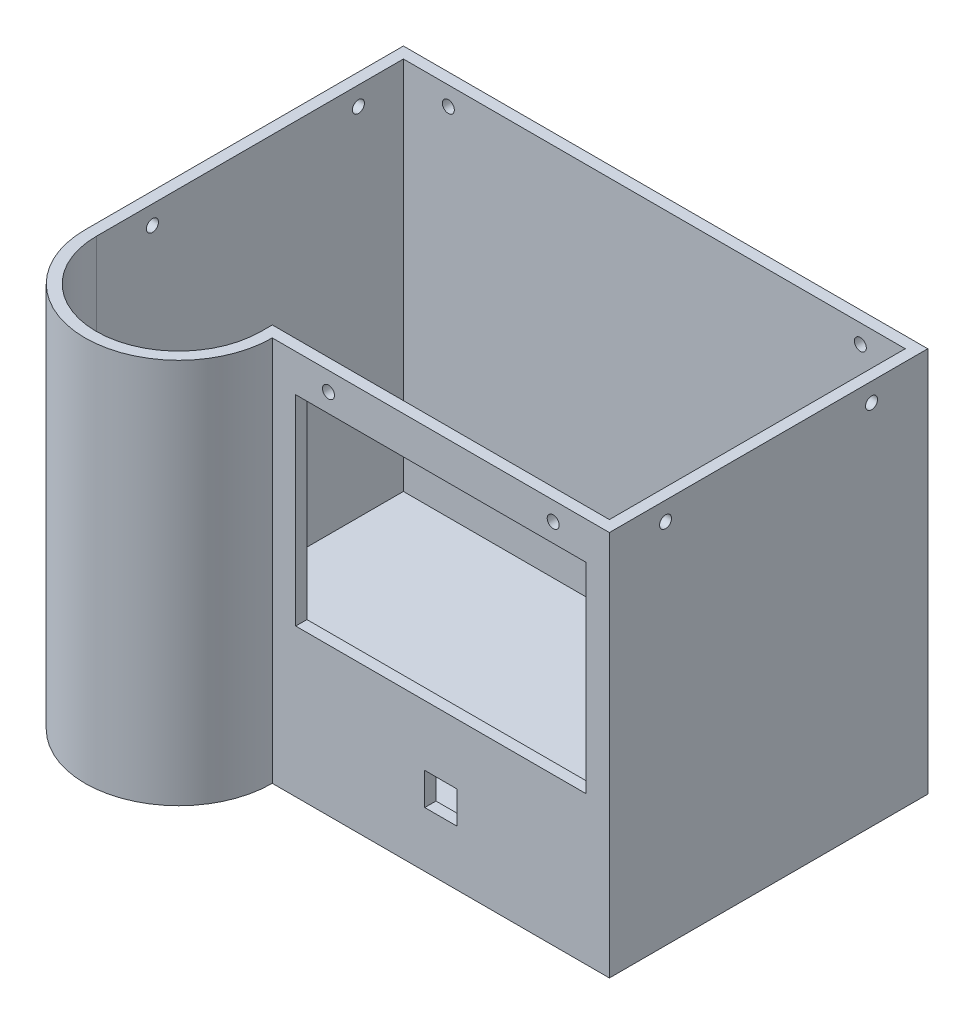
ISO-10303-21;
HEADER;
FILE_DESCRIPTION(('STEP AP214'),'2;1');
FILE_NAME('part.step','',(''),(''),'','','');
FILE_SCHEMA(('AUTOMOTIVE_DESIGN { 1 0 10303 214 1 1 1 1 }'));
ENDSEC;
DATA;
#1=APPLICATION_CONTEXT('core data for automotive mechanical design processes');
#2=APPLICATION_PROTOCOL_DEFINITION('international standard','automotive_design',2000,#1);
#3=PRODUCT_CONTEXT('',#1,'mechanical');
#4=PRODUCT('Part','Part','',(#3));
#5=PRODUCT_RELATED_PRODUCT_CATEGORY('part','',(#4));
#6=PRODUCT_DEFINITION_FORMATION('','',#4);
#7=PRODUCT_DEFINITION_CONTEXT('part definition',#1,'design');
#8=PRODUCT_DEFINITION('design','',#6,#7);
#9=PRODUCT_DEFINITION_SHAPE('','',#8);
#10=(LENGTH_UNIT() NAMED_UNIT(*) SI_UNIT(.MILLI.,.METRE.));
#11=(NAMED_UNIT(*) PLANE_ANGLE_UNIT() SI_UNIT($,.RADIAN.));
#12=(NAMED_UNIT(*) SI_UNIT($,.STERADIAN.) SOLID_ANGLE_UNIT());
#13=UNCERTAINTY_MEASURE_WITH_UNIT(LENGTH_MEASURE(1.E-05),#10,'distance_accuracy_value','');
#14=(GEOMETRIC_REPRESENTATION_CONTEXT(3) GLOBAL_UNCERTAINTY_ASSIGNED_CONTEXT((#13)) GLOBAL_UNIT_ASSIGNED_CONTEXT((#10,
#11,#12)) REPRESENTATION_CONTEXT('',''));
#15=CARTESIAN_POINT('',(0.,0.,0.));
#16=DIRECTION('',(0.,0.,1.));
#17=DIRECTION('',(1.,0.,0.));
#18=AXIS2_PLACEMENT_3D('',#15,#16,#17);
#19=CARTESIAN_POINT('',(25.,3.,0.));
#20=DIRECTION('',(0.,1.,0.));
#21=DIRECTION('',(0.,0.,1.));
#22=AXIS2_PLACEMENT_3D('',#19,#20,#21);
#23=PLANE('',#22);
#24=CARTESIAN_POINT('',(25.,3.,0.));
#25=DIRECTION('',(0.,1.,0.));
#26=DIRECTION('',(0.,0.,1.));
#27=AXIS2_PLACEMENT_3D('',#24,#25,#26);
#28=CIRCLE('',#27,22.);
#29=CARTESIAN_POINT('',(3.00000000000001,3.,0.));
#30=VERTEX_POINT('',#29);
#31=CARTESIAN_POINT('',(47.,3.,0.));
#32=VERTEX_POINT('',#31);
#33=EDGE_CURVE('E227',#30,#32,#28,.T.);
#34=ORIENTED_EDGE('',*,*,#33,.T.);
#35=DIRECTION('',(0.,0.,-1.));
#36=VECTOR('',#35,1.);
#37=CARTESIAN_POINT('',(47.,3.,0.));
#38=LINE('',#37,#36);
#39=CARTESIAN_POINT('',(47.,3.,-3.));
#40=VERTEX_POINT('',#39);
#41=EDGE_CURVE('E242',#32,#40,#38,.T.);
#42=ORIENTED_EDGE('',*,*,#41,.T.);
#43=DIRECTION('',(1.,0.,0.));
#44=VECTOR('',#43,1.);
#45=CARTESIAN_POINT('',(0.,3.,-3.));
#46=LINE('',#45,#44);
#47=CARTESIAN_POINT('',(137.,3.,-3.));
#48=VERTEX_POINT('',#47);
#49=EDGE_CURVE('E294',#40,#48,#46,.T.);
#50=ORIENTED_EDGE('',*,*,#49,.T.);
#51=DIRECTION('',(0.,0.,1.));
#52=VECTOR('',#51,1.);
#53=CARTESIAN_POINT('',(137.,3.,0.));
#54=LINE('',#53,#52);
#55=CARTESIAN_POINT('',(137.,3.,-82.));
#56=VERTEX_POINT('',#55);
#57=EDGE_CURVE('E290',#56,#48,#54,.T.);
#58=ORIENTED_EDGE('',*,*,#57,.F.);
#59=DIRECTION('',(1.,0.,0.));
#60=VECTOR('',#59,1.);
#61=CARTESIAN_POINT('',(0.,3.,-82.));
#62=LINE('',#61,#60);
#63=CARTESIAN_POINT('',(3.,3.,-82.));
#64=VERTEX_POINT('',#63);
#65=EDGE_CURVE('E286',#64,#56,#62,.T.);
#66=ORIENTED_EDGE('',*,*,#65,.F.);
#67=DIRECTION('',(0.,0.,1.));
#68=VECTOR('',#67,1.);
#69=CARTESIAN_POINT('',(3.00000000000001,3.,0.));
#70=LINE('',#69,#68);
#71=EDGE_CURVE('E283',#64,#30,#70,.T.);
#72=ORIENTED_EDGE('',*,*,#71,.T.);
#73=EDGE_LOOP('',(#34,#42,#50,#58,#66,#72));
#74=FACE_BOUND('',#73,.T.);
#75=CARTESIAN_POINT('',(25.,3.,0.));
#76=DIRECTION('',(0.,1.,0.));
#77=DIRECTION('',(0.,0.,1.));
#78=AXIS2_PLACEMENT_3D('',#75,#76,#77);
#79=CIRCLE('',#78,13.8);
#80=CARTESIAN_POINT('',(25.,3.,13.8));
#81=VERTEX_POINT('',#80);
#82=EDGE_CURVE('E323',#81,#81,#79,.T.);
#83=ORIENTED_EDGE('',*,*,#82,.F.);
#84=EDGE_LOOP('',(#83));
#85=FACE_BOUND('',#84,.T.);
#86=ADVANCED_FACE('F40',(#74,#85),#23,.T.);
#87=CARTESIAN_POINT('',(25.,0.,0.));
#88=DIRECTION('',(0.,1.,0.));
#89=DIRECTION('',(0.,0.,1.));
#90=AXIS2_PLACEMENT_3D('',#87,#88,#89);
#91=PLANE('',#90);
#92=CARTESIAN_POINT('',(25.,0.,0.));
#93=DIRECTION('',(0.,1.,0.));
#94=DIRECTION('',(0.,0.,1.));
#95=AXIS2_PLACEMENT_3D('',#92,#93,#94);
#96=CIRCLE('',#95,25.);
#97=CARTESIAN_POINT('',(0.,0.,0.));
#98=VERTEX_POINT('',#97);
#99=CARTESIAN_POINT('',(50.,0.,0.));
#100=VERTEX_POINT('',#99);
#101=EDGE_CURVE('E327',#98,#100,#96,.T.);
#102=ORIENTED_EDGE('',*,*,#101,.F.);
#103=DIRECTION('',(0.,0.,1.));
#104=VECTOR('',#103,1.);
#105=CARTESIAN_POINT('',(0.,0.,0.));
#106=LINE('',#105,#104);
#107=CARTESIAN_POINT('',(0.,0.,-85.));
#108=VERTEX_POINT('',#107);
#109=EDGE_CURVE('E343',#108,#98,#106,.T.);
#110=ORIENTED_EDGE('',*,*,#109,.F.);
#111=DIRECTION('',(-1.,0.,0.));
#112=VECTOR('',#111,1.);
#113=CARTESIAN_POINT('',(0.,0.,-85.));
#114=LINE('',#113,#112);
#115=CARTESIAN_POINT('',(140.,0.,-85.));
#116=VERTEX_POINT('',#115);
#117=EDGE_CURVE('E340',#116,#108,#114,.T.);
#118=ORIENTED_EDGE('',*,*,#117,.F.);
#119=DIRECTION('',(0.,0.,-1.));
#120=VECTOR('',#119,1.);
#121=CARTESIAN_POINT('',(140.,0.,0.));
#122=LINE('',#121,#120);
#123=CARTESIAN_POINT('',(140.,0.,0.));
#124=VERTEX_POINT('',#123);
#125=EDGE_CURVE('E337',#124,#116,#122,.T.);
#126=ORIENTED_EDGE('',*,*,#125,.F.);
#127=DIRECTION('',(1.,0.,0.));
#128=VECTOR('',#127,1.);
#129=CARTESIAN_POINT('',(50.,0.,0.));
#130=LINE('',#129,#128);
#131=EDGE_CURVE('E334',#100,#124,#130,.T.);
#132=ORIENTED_EDGE('',*,*,#131,.F.);
#133=EDGE_LOOP('',(#102,#110,#118,#126,#132));
#134=FACE_BOUND('',#133,.T.);
#135=CARTESIAN_POINT('',(25.,0.,0.));
#136=DIRECTION('',(0.,1.,0.));
#137=DIRECTION('',(0.,0.,1.));
#138=AXIS2_PLACEMENT_3D('',#135,#136,#137);
#139=CIRCLE('',#138,13.8);
#140=CARTESIAN_POINT('',(25.,0.,13.8));
#141=VERTEX_POINT('',#140);
#142=EDGE_CURVE('E322',#141,#141,#139,.T.);
#143=ORIENTED_EDGE('',*,*,#142,.T.);
#144=EDGE_LOOP('',(#143));
#145=FACE_BOUND('',#144,.T.);
#146=ADVANCED_FACE('F467',(#134,#145),#91,.F.);
#147=CARTESIAN_POINT('',(25.,3.,0.));
#148=DIRECTION('',(0.,-1.,0.));
#149=DIRECTION('',(0.,0.,-1.));
#150=AXIS2_PLACEMENT_3D('',#147,#148,#149);
#151=CYLINDRICAL_SURFACE('',#150,25.);
#152=ORIENTED_EDGE('',*,*,#101,.T.);
#153=DIRECTION('',(0.,-1.,0.));
#154=VECTOR('',#153,1.);
#155=CARTESIAN_POINT('',(50.,3.,0.));
#156=LINE('',#155,#154);
#157=CARTESIAN_POINT('',(50.,103.,0.));
#158=VERTEX_POINT('',#157);
#159=EDGE_CURVE('E362',#158,#100,#156,.T.);
#160=ORIENTED_EDGE('',*,*,#159,.F.);
#161=CARTESIAN_POINT('',(25.,103.,0.));
#162=DIRECTION('',(0.,1.,0.));
#163=DIRECTION('',(0.,0.,1.));
#164=AXIS2_PLACEMENT_3D('',#161,#162,#163);
#165=CIRCLE('',#164,25.);
#166=CARTESIAN_POINT('',(0.,103.,0.));
#167=VERTEX_POINT('',#166);
#168=EDGE_CURVE('E264',#167,#158,#165,.T.);
#169=ORIENTED_EDGE('',*,*,#168,.F.);
#170=DIRECTION('',(0.,-1.,0.));
#171=VECTOR('',#170,1.);
#172=CARTESIAN_POINT('',(0.,3.,0.));
#173=LINE('',#172,#171);
#174=EDGE_CURVE('E346',#167,#98,#173,.T.);
#175=ORIENTED_EDGE('',*,*,#174,.T.);
#176=EDGE_LOOP('',(#152,#160,#169,#175));
#177=FACE_BOUND('',#176,.T.);
#178=ADVANCED_FACE('F42',(#177),#151,.T.);
#179=CARTESIAN_POINT('',(50.,3.,0.));
#180=DIRECTION('',(0.,0.,-1.));
#181=DIRECTION('',(-1.,0.,0.));
#182=AXIS2_PLACEMENT_3D('',#179,#180,#181);
#183=PLANE('',#182);
#184=CARTESIAN_POINT('',(65.,98.,0.));
#185=DIRECTION('',(0.,0.,1.));
#186=DIRECTION('',(1.,0.,0.));
#187=AXIS2_PLACEMENT_3D('',#184,#185,#186);
#188=CIRCLE('',#187,1.60000000000001);
#189=CARTESIAN_POINT('',(66.6,98.,0.));
#190=VERTEX_POINT('',#189);
#191=EDGE_CURVE('E391',#190,#190,#188,.T.);
#192=ORIENTED_EDGE('',*,*,#191,.F.);
#193=EDGE_LOOP('',(#192));
#194=FACE_BOUND('',#193,.T.);
#195=CARTESIAN_POINT('',(125.,98.,0.));
#196=DIRECTION('',(0.,0.,1.));
#197=DIRECTION('',(1.,0.,0.));
#198=AXIS2_PLACEMENT_3D('',#195,#196,#197);
#199=CIRCLE('',#198,1.60000000000002);
#200=CARTESIAN_POINT('',(126.6,98.,0.));
#201=VERTEX_POINT('',#200);
#202=EDGE_CURVE('E404',#201,#201,#199,.T.);
#203=ORIENTED_EDGE('',*,*,#202,.F.);
#204=EDGE_LOOP('',(#203));
#205=FACE_BOUND('',#204,.T.);
#206=DIRECTION('',(1.,0.,0.));
#207=VECTOR('',#206,1.);
#208=CARTESIAN_POINT('',(90.7,14.762,0.));
#209=LINE('',#208,#207);
#210=CARTESIAN_POINT('',(90.7,14.762,0.));
#211=VERTEX_POINT('',#210);
#212=CARTESIAN_POINT('',(99.3,14.762,0.));
#213=VERTEX_POINT('',#212);
#214=EDGE_CURVE('E186',#211,#213,#209,.T.);
#215=ORIENTED_EDGE('',*,*,#214,.F.);
#216=DIRECTION('',(0.,-1.,0.));
#217=VECTOR('',#216,1.);
#218=CARTESIAN_POINT('',(90.7,23.362,0.));
#219=LINE('',#218,#217);
#220=CARTESIAN_POINT('',(90.7,23.362,0.));
#221=VERTEX_POINT('',#220);
#222=EDGE_CURVE('E58',#221,#211,#219,.T.);
#223=ORIENTED_EDGE('',*,*,#222,.F.);
#224=DIRECTION('',(-1.,0.,0.));
#225=VECTOR('',#224,1.);
#226=CARTESIAN_POINT('',(90.7,23.362,0.));
#227=LINE('',#226,#225);
#228=CARTESIAN_POINT('',(99.3,23.362,0.));
#229=VERTEX_POINT('',#228);
#230=EDGE_CURVE('E194',#229,#221,#227,.T.);
#231=ORIENTED_EDGE('',*,*,#230,.F.);
#232=DIRECTION('',(0.,1.,0.));
#233=VECTOR('',#232,1.);
#234=CARTESIAN_POINT('',(99.3,23.362,0.));
#235=LINE('',#234,#233);
#236=EDGE_CURVE('E176',#213,#229,#235,.T.);
#237=ORIENTED_EDGE('',*,*,#236,.F.);
#238=EDGE_LOOP('',(#215,#223,#231,#237));
#239=FACE_BOUND('',#238,.T.);
#240=DIRECTION('',(1.,0.,0.));
#241=VECTOR('',#240,1.);
#242=CARTESIAN_POINT('',(56.25,39.5,0.));
#243=LINE('',#242,#241);
#244=CARTESIAN_POINT('',(56.25,39.5,0.));
#245=VERTEX_POINT('',#244);
#246=CARTESIAN_POINT('',(133.75,39.5,0.));
#247=VERTEX_POINT('',#246);
#248=EDGE_CURVE('E211',#245,#247,#243,.T.);
#249=ORIENTED_EDGE('',*,*,#248,.F.);
#250=DIRECTION('',(0.,-1.,0.));
#251=VECTOR('',#250,1.);
#252=CARTESIAN_POINT('',(56.25,93.,0.));
#253=LINE('',#252,#251);
#254=CARTESIAN_POINT('',(56.25,93.,0.));
#255=VERTEX_POINT('',#254);
#256=EDGE_CURVE('E204',#255,#245,#253,.T.);
#257=ORIENTED_EDGE('',*,*,#256,.F.);
#258=DIRECTION('',(-1.,0.,0.));
#259=VECTOR('',#258,1.);
#260=CARTESIAN_POINT('',(56.25,93.,0.));
#261=LINE('',#260,#259);
#262=CARTESIAN_POINT('',(133.75,93.,0.));
#263=VERTEX_POINT('',#262);
#264=EDGE_CURVE('E219',#263,#255,#261,.T.);
#265=ORIENTED_EDGE('',*,*,#264,.F.);
#266=DIRECTION('',(0.,1.,0.));
#267=VECTOR('',#266,1.);
#268=CARTESIAN_POINT('',(133.75,93.,0.));
#269=LINE('',#268,#267);
#270=EDGE_CURVE('E215',#247,#263,#269,.T.);
#271=ORIENTED_EDGE('',*,*,#270,.F.);
#272=EDGE_LOOP('',(#249,#257,#265,#271));
#273=FACE_BOUND('',#272,.T.);
#274=ORIENTED_EDGE('',*,*,#131,.T.);
#275=DIRECTION('',(0.,-1.,0.));
#276=VECTOR('',#275,1.);
#277=CARTESIAN_POINT('',(140.,3.,0.));
#278=LINE('',#277,#276);
#279=CARTESIAN_POINT('',(140.,103.,0.));
#280=VERTEX_POINT('',#279);
#281=EDGE_CURVE('E358',#280,#124,#278,.T.);
#282=ORIENTED_EDGE('',*,*,#281,.F.);
#283=DIRECTION('',(1.,0.,0.));
#284=VECTOR('',#283,1.);
#285=CARTESIAN_POINT('',(0.,103.,0.));
#286=LINE('',#285,#284);
#287=EDGE_CURVE('E268',#158,#280,#286,.T.);
#288=ORIENTED_EDGE('',*,*,#287,.F.);
#289=ORIENTED_EDGE('',*,*,#159,.T.);
#290=EDGE_LOOP('',(#274,#282,#288,#289));
#291=FACE_BOUND('',#290,.T.);
#292=ADVANCED_FACE('F191',(#194,#205,#239,#273,#291),#183,.F.);
#293=CARTESIAN_POINT('',(140.,3.,0.));
#294=DIRECTION('',(-1.,0.,0.));
#295=DIRECTION('',(0.,0.,1.));
#296=AXIS2_PLACEMENT_3D('',#293,#294,#295);
#297=PLANE('',#296);
#298=CARTESIAN_POINT('',(140.,98.,-15.));
#299=DIRECTION('',(1.,0.,0.));
#300=DIRECTION('',(0.,0.,-1.));
#301=AXIS2_PLACEMENT_3D('',#298,#299,#300);
#302=CIRCLE('',#301,1.60000000000001);
#303=CARTESIAN_POINT('',(140.,98.,-16.6));
#304=VERTEX_POINT('',#303);
#305=EDGE_CURVE('E400',#304,#304,#302,.T.);
#306=ORIENTED_EDGE('',*,*,#305,.F.);
#307=EDGE_LOOP('',(#306));
#308=FACE_BOUND('',#307,.T.);
#309=CARTESIAN_POINT('',(140.,98.,-70.));
#310=DIRECTION('',(1.,0.,0.));
#311=DIRECTION('',(0.,0.,-1.));
#312=AXIS2_PLACEMENT_3D('',#309,#310,#311);
#313=CIRCLE('',#312,1.59999999999999);
#314=CARTESIAN_POINT('',(140.,98.,-71.6));
#315=VERTEX_POINT('',#314);
#316=EDGE_CURVE('E413',#315,#315,#313,.T.);
#317=ORIENTED_EDGE('',*,*,#316,.F.);
#318=EDGE_LOOP('',(#317));
#319=FACE_BOUND('',#318,.T.);
#320=ORIENTED_EDGE('',*,*,#125,.T.);
#321=DIRECTION('',(0.,-1.,0.));
#322=VECTOR('',#321,1.);
#323=CARTESIAN_POINT('',(140.,3.,-85.));
#324=LINE('',#323,#322);
#325=CARTESIAN_POINT('',(140.,103.,-85.));
#326=VERTEX_POINT('',#325);
#327=EDGE_CURVE('E354',#326,#116,#324,.T.);
#328=ORIENTED_EDGE('',*,*,#327,.F.);
#329=DIRECTION('',(0.,0.,-1.));
#330=VECTOR('',#329,1.);
#331=CARTESIAN_POINT('',(140.,103.,0.));
#332=LINE('',#331,#330);
#333=EDGE_CURVE('E272',#280,#326,#332,.T.);
#334=ORIENTED_EDGE('',*,*,#333,.F.);
#335=ORIENTED_EDGE('',*,*,#281,.T.);
#336=EDGE_LOOP('',(#320,#328,#334,#335));
#337=FACE_BOUND('',#336,.T.);
#338=ADVANCED_FACE('F456',(#308,#319,#337),#297,.F.);
#339=CARTESIAN_POINT('',(0.,3.,-85.));
#340=DIRECTION('',(0.,0.,1.));
#341=DIRECTION('',(1.,0.,0.));
#342=AXIS2_PLACEMENT_3D('',#339,#340,#341);
#343=PLANE('',#342);
#344=CARTESIAN_POINT('',(125.,98.,-85.));
#345=DIRECTION('',(0.,0.,-1.));
#346=DIRECTION('',(-1.,0.,0.));
#347=AXIS2_PLACEMENT_3D('',#344,#345,#346);
#348=CIRCLE('',#347,1.60000000000001);
#349=CARTESIAN_POINT('',(123.4,98.,-85.));
#350=VERTEX_POINT('',#349);
#351=EDGE_CURVE('E410',#350,#350,#348,.T.);
#352=ORIENTED_EDGE('',*,*,#351,.F.);
#353=EDGE_LOOP('',(#352));
#354=FACE_BOUND('',#353,.T.);
#355=CARTESIAN_POINT('',(15.,98.,-85.));
#356=DIRECTION('',(0.,0.,-1.));
#357=DIRECTION('',(-1.,0.,0.));
#358=AXIS2_PLACEMENT_3D('',#355,#356,#357);
#359=CIRCLE('',#358,1.60000000000001);
#360=CARTESIAN_POINT('',(13.4,98.,-85.));
#361=VERTEX_POINT('',#360);
#362=EDGE_CURVE('E423',#361,#361,#359,.T.);
#363=ORIENTED_EDGE('',*,*,#362,.F.);
#364=EDGE_LOOP('',(#363));
#365=FACE_BOUND('',#364,.T.);
#366=ORIENTED_EDGE('',*,*,#117,.T.);
#367=DIRECTION('',(0.,-1.,0.));
#368=VECTOR('',#367,1.);
#369=CARTESIAN_POINT('',(0.,3.,-85.));
#370=LINE('',#369,#368);
#371=CARTESIAN_POINT('',(0.,103.,-85.));
#372=VERTEX_POINT('',#371);
#373=EDGE_CURVE('E350',#372,#108,#370,.T.);
#374=ORIENTED_EDGE('',*,*,#373,.F.);
#375=DIRECTION('',(-1.,0.,0.));
#376=VECTOR('',#375,1.);
#377=CARTESIAN_POINT('',(0.,103.,-85.));
#378=LINE('',#377,#376);
#379=EDGE_CURVE('E276',#326,#372,#378,.T.);
#380=ORIENTED_EDGE('',*,*,#379,.F.);
#381=ORIENTED_EDGE('',*,*,#327,.T.);
#382=EDGE_LOOP('',(#366,#374,#380,#381));
#383=FACE_BOUND('',#382,.T.);
#384=ADVANCED_FACE('F463',(#354,#365,#383),#343,.F.);
#385=CARTESIAN_POINT('',(0.,3.,0.));
#386=DIRECTION('',(1.,0.,0.));
#387=DIRECTION('',(0.,0.,-1.));
#388=AXIS2_PLACEMENT_3D('',#385,#386,#387);
#389=PLANE('',#388);
#390=CARTESIAN_POINT('',(0.,98.,-70.));
#391=DIRECTION('',(-1.,0.,0.));
#392=DIRECTION('',(0.,0.,1.));
#393=AXIS2_PLACEMENT_3D('',#390,#391,#392);
#394=CIRCLE('',#393,1.60000000000001);
#395=CARTESIAN_POINT('',(0.,98.,-68.4));
#396=VERTEX_POINT('',#395);
#397=EDGE_CURVE('E417',#396,#396,#394,.T.);
#398=ORIENTED_EDGE('',*,*,#397,.F.);
#399=EDGE_LOOP('',(#398));
#400=FACE_BOUND('',#399,.T.);
#401=CARTESIAN_POINT('',(0.,98.,-15.));
#402=DIRECTION('',(-1.,0.,0.));
#403=DIRECTION('',(0.,0.,1.));
#404=AXIS2_PLACEMENT_3D('',#401,#402,#403);
#405=CIRCLE('',#404,1.60000000000001);
#406=CARTESIAN_POINT('',(0.,98.,-13.4));
#407=VERTEX_POINT('',#406);
#408=EDGE_CURVE('E425',#407,#407,#405,.T.);
#409=ORIENTED_EDGE('',*,*,#408,.F.);
#410=EDGE_LOOP('',(#409));
#411=FACE_BOUND('',#410,.T.);
#412=ORIENTED_EDGE('',*,*,#109,.T.);
#413=ORIENTED_EDGE('',*,*,#174,.F.);
#414=DIRECTION('',(0.,0.,1.));
#415=VECTOR('',#414,1.);
#416=CARTESIAN_POINT('',(0.,103.,0.));
#417=LINE('',#416,#415);
#418=EDGE_CURVE('E260',#372,#167,#417,.T.);
#419=ORIENTED_EDGE('',*,*,#418,.F.);
#420=ORIENTED_EDGE('',*,*,#373,.T.);
#421=EDGE_LOOP('',(#412,#413,#419,#420));
#422=FACE_BOUND('',#421,.T.);
#423=ADVANCED_FACE('F483',(#400,#411,#422),#389,.F.);
#424=CARTESIAN_POINT('',(25.,3.,0.));
#425=DIRECTION('',(0.,-1.,0.));
#426=DIRECTION('',(0.,0.,-1.));
#427=AXIS2_PLACEMENT_3D('',#424,#425,#426);
#428=CYLINDRICAL_SURFACE('',#427,13.8);
#429=ORIENTED_EDGE('',*,*,#82,.T.);
#430=EDGE_LOOP('',(#429));
#431=FACE_BOUND('',#430,.T.);
#432=ORIENTED_EDGE('',*,*,#142,.F.);
#433=EDGE_LOOP('',(#432));
#434=FACE_BOUND('',#433,.T.);
#435=ADVANCED_FACE('F480',(#431,#434),#428,.F.);
#436=CARTESIAN_POINT('',(25.,103.,0.));
#437=DIRECTION('',(0.,-1.,0.));
#438=DIRECTION('',(0.,0.,-1.));
#439=AXIS2_PLACEMENT_3D('',#436,#437,#438);
#440=CYLINDRICAL_SURFACE('',#439,22.);
#441=ORIENTED_EDGE('',*,*,#33,.F.);
#442=DIRECTION('',(0.,-1.,0.));
#443=VECTOR('',#442,1.);
#444=CARTESIAN_POINT('',(3.00000000000001,103.,0.));
#445=LINE('',#444,#443);
#446=CARTESIAN_POINT('',(3.00000000000001,103.,0.));
#447=VERTEX_POINT('',#446);
#448=EDGE_CURVE('E318',#447,#30,#445,.T.);
#449=ORIENTED_EDGE('',*,*,#448,.F.);
#450=CARTESIAN_POINT('',(25.,103.,0.));
#451=DIRECTION('',(0.,1.,0.));
#452=DIRECTION('',(0.,0.,1.));
#453=AXIS2_PLACEMENT_3D('',#450,#451,#452);
#454=CIRCLE('',#453,22.);
#455=CARTESIAN_POINT('',(47.,103.,0.));
#456=VERTEX_POINT('',#455);
#457=EDGE_CURVE('E237',#447,#456,#454,.T.);
#458=ORIENTED_EDGE('',*,*,#457,.T.);
#459=DIRECTION('',(0.,-1.,0.));
#460=VECTOR('',#459,1.);
#461=CARTESIAN_POINT('',(47.,103.,0.));
#462=LINE('',#461,#460);
#463=EDGE_CURVE('E280',#456,#32,#462,.T.);
#464=ORIENTED_EDGE('',*,*,#463,.T.);
#465=EDGE_LOOP('',(#441,#449,#458,#464));
#466=FACE_BOUND('',#465,.T.);
#467=ADVANCED_FACE('F541',(#466),#440,.F.);
#468=CARTESIAN_POINT('',(3.00000000000001,103.,0.));
#469=DIRECTION('',(1.,0.,0.));
#470=DIRECTION('',(0.,0.,-1.));
#471=AXIS2_PLACEMENT_3D('',#468,#469,#470);
#472=PLANE('',#471);
#473=CARTESIAN_POINT('',(3.00000000000002,98.,-70.));
#474=DIRECTION('',(1.,0.,0.));
#475=DIRECTION('',(0.,0.,-1.));
#476=AXIS2_PLACEMENT_3D('',#473,#474,#475);
#477=CIRCLE('',#476,1.60000000000001);
#478=CARTESIAN_POINT('',(3.00000000000002,98.,-71.6));
#479=VERTEX_POINT('',#478);
#480=EDGE_CURVE('E44',#479,#479,#477,.T.);
#481=ORIENTED_EDGE('',*,*,#480,.F.);
#482=EDGE_LOOP('',(#481));
#483=FACE_BOUND('',#482,.T.);
#484=CARTESIAN_POINT('',(3.00000000000001,98.,-15.));
#485=DIRECTION('',(1.,0.,0.));
#486=DIRECTION('',(0.,0.,-1.));
#487=AXIS2_PLACEMENT_3D('',#484,#485,#486);
#488=CIRCLE('',#487,1.60000000000001);
#489=CARTESIAN_POINT('',(3.00000000000001,98.,-16.6));
#490=VERTEX_POINT('',#489);
#491=EDGE_CURVE('E414',#490,#490,#488,.T.);
#492=ORIENTED_EDGE('',*,*,#491,.F.);
#493=EDGE_LOOP('',(#492));
#494=FACE_BOUND('',#493,.T.);
#495=ORIENTED_EDGE('',*,*,#71,.F.);
#496=DIRECTION('',(0.,-1.,0.));
#497=VECTOR('',#496,1.);
#498=CARTESIAN_POINT('',(3.,103.,-82.));
#499=LINE('',#498,#497);
#500=CARTESIAN_POINT('',(3.,103.,-82.));
#501=VERTEX_POINT('',#500);
#502=EDGE_CURVE('E314',#501,#64,#499,.T.);
#503=ORIENTED_EDGE('',*,*,#502,.F.);
#504=DIRECTION('',(0.,0.,1.));
#505=VECTOR('',#504,1.);
#506=CARTESIAN_POINT('',(3.00000000000001,103.,0.));
#507=LINE('',#506,#505);
#508=EDGE_CURVE('E241',#501,#447,#507,.T.);
#509=ORIENTED_EDGE('',*,*,#508,.T.);
#510=ORIENTED_EDGE('',*,*,#448,.T.);
#511=EDGE_LOOP('',(#495,#503,#509,#510));
#512=FACE_BOUND('',#511,.T.);
#513=ADVANCED_FACE('F538',(#483,#494,#512),#472,.T.);
#514=CARTESIAN_POINT('',(0.,103.,-82.));
#515=DIRECTION('',(0.,0.,-1.));
#516=DIRECTION('',(-1.,0.,0.));
#517=AXIS2_PLACEMENT_3D('',#514,#515,#516);
#518=PLANE('',#517);
#519=CARTESIAN_POINT('',(125.,98.,-82.));
#520=DIRECTION('',(0.,0.,-1.));
#521=DIRECTION('',(-1.,0.,0.));
#522=AXIS2_PLACEMENT_3D('',#519,#520,#521);
#523=CIRCLE('',#522,1.60000000000001);
#524=CARTESIAN_POINT('',(123.4,98.,-82.));
#525=VERTEX_POINT('',#524);
#526=EDGE_CURVE('E409',#525,#525,#523,.T.);
#527=ORIENTED_EDGE('',*,*,#526,.T.);
#528=EDGE_LOOP('',(#527));
#529=FACE_BOUND('',#528,.T.);
#530=CARTESIAN_POINT('',(15.,98.,-82.));
#531=DIRECTION('',(0.,0.,-1.));
#532=DIRECTION('',(-1.,0.,0.));
#533=AXIS2_PLACEMENT_3D('',#530,#531,#532);
#534=CIRCLE('',#533,1.60000000000001);
#535=CARTESIAN_POINT('',(13.4,98.,-82.));
#536=VERTEX_POINT('',#535);
#537=EDGE_CURVE('E405',#536,#536,#534,.T.);
#538=ORIENTED_EDGE('',*,*,#537,.T.);
#539=EDGE_LOOP('',(#538));
#540=FACE_BOUND('',#539,.T.);
#541=ORIENTED_EDGE('',*,*,#65,.T.);
#542=DIRECTION('',(0.,-1.,0.));
#543=VECTOR('',#542,1.);
#544=CARTESIAN_POINT('',(137.,103.,-82.));
#545=LINE('',#544,#543);
#546=CARTESIAN_POINT('',(137.,103.,-82.));
#547=VERTEX_POINT('',#546);
#548=EDGE_CURVE('E310',#547,#56,#545,.T.);
#549=ORIENTED_EDGE('',*,*,#548,.F.);
#550=DIRECTION('',(1.,0.,0.));
#551=VECTOR('',#550,1.);
#552=CARTESIAN_POINT('',(0.,103.,-82.));
#553=LINE('',#552,#551);
#554=EDGE_CURVE('E246',#501,#547,#553,.T.);
#555=ORIENTED_EDGE('',*,*,#554,.F.);
#556=ORIENTED_EDGE('',*,*,#502,.T.);
#557=EDGE_LOOP('',(#541,#549,#555,#556));
#558=FACE_BOUND('',#557,.T.);
#559=ADVANCED_FACE('F535',(#529,#540,#558),#518,.F.);
#560=CARTESIAN_POINT('',(137.,103.,0.));
#561=DIRECTION('',(1.,0.,0.));
#562=DIRECTION('',(0.,0.,-1.));
#563=AXIS2_PLACEMENT_3D('',#560,#561,#562);
#564=PLANE('',#563);
#565=CARTESIAN_POINT('',(137.,98.,-15.));
#566=DIRECTION('',(1.,0.,0.));
#567=DIRECTION('',(0.,0.,-1.));
#568=AXIS2_PLACEMENT_3D('',#565,#566,#567);
#569=CIRCLE('',#568,1.60000000000001);
#570=CARTESIAN_POINT('',(137.,98.,-16.6));
#571=VERTEX_POINT('',#570);
#572=EDGE_CURVE('E399',#571,#571,#569,.T.);
#573=ORIENTED_EDGE('',*,*,#572,.T.);
#574=EDGE_LOOP('',(#573));
#575=FACE_BOUND('',#574,.T.);
#576=CARTESIAN_POINT('',(137.,98.,-70.));
#577=DIRECTION('',(1.,0.,0.));
#578=DIRECTION('',(0.,0.,-1.));
#579=AXIS2_PLACEMENT_3D('',#576,#577,#578);
#580=CIRCLE('',#579,1.59999999999999);
#581=CARTESIAN_POINT('',(137.,98.,-71.6));
#582=VERTEX_POINT('',#581);
#583=EDGE_CURVE('E395',#582,#582,#580,.T.);
#584=ORIENTED_EDGE('',*,*,#583,.T.);
#585=EDGE_LOOP('',(#584));
#586=FACE_BOUND('',#585,.T.);
#587=ORIENTED_EDGE('',*,*,#57,.T.);
#588=DIRECTION('',(0.,-1.,0.));
#589=VECTOR('',#588,1.);
#590=CARTESIAN_POINT('',(137.,103.,-3.));
#591=LINE('',#590,#589);
#592=CARTESIAN_POINT('',(137.,103.,-3.));
#593=VERTEX_POINT('',#592);
#594=EDGE_CURVE('E306',#593,#48,#591,.T.);
#595=ORIENTED_EDGE('',*,*,#594,.F.);
#596=DIRECTION('',(0.,0.,1.));
#597=VECTOR('',#596,1.);
#598=CARTESIAN_POINT('',(137.,103.,0.));
#599=LINE('',#598,#597);
#600=EDGE_CURVE('E249',#547,#593,#599,.T.);
#601=ORIENTED_EDGE('',*,*,#600,.F.);
#602=ORIENTED_EDGE('',*,*,#548,.T.);
#603=EDGE_LOOP('',(#587,#595,#601,#602));
#604=FACE_BOUND('',#603,.T.);
#605=ADVANCED_FACE('F531',(#575,#586,#604),#564,.F.);
#606=CARTESIAN_POINT('',(0.,103.,-3.));
#607=DIRECTION('',(0.,0.,-1.));
#608=DIRECTION('',(-1.,0.,0.));
#609=AXIS2_PLACEMENT_3D('',#606,#607,#608);
#610=PLANE('',#609);
#611=CARTESIAN_POINT('',(65.,98.,-3.));
#612=DIRECTION('',(0.,0.,-1.));
#613=DIRECTION('',(-1.,0.,0.));
#614=AXIS2_PLACEMENT_3D('',#611,#612,#613);
#615=CIRCLE('',#614,1.60000000000001);
#616=CARTESIAN_POINT('',(63.4,98.,-3.));
#617=VERTEX_POINT('',#616);
#618=EDGE_CURVE('E390',#617,#617,#615,.T.);
#619=ORIENTED_EDGE('',*,*,#618,.F.);
#620=EDGE_LOOP('',(#619));
#621=FACE_BOUND('',#620,.T.);
#622=CARTESIAN_POINT('',(125.,98.,-3.));
#623=DIRECTION('',(0.,0.,-1.));
#624=DIRECTION('',(-1.,0.,0.));
#625=AXIS2_PLACEMENT_3D('',#622,#623,#624);
#626=CIRCLE('',#625,1.60000000000002);
#627=CARTESIAN_POINT('',(123.4,98.,-3.));
#628=VERTEX_POINT('',#627);
#629=EDGE_CURVE('E386',#628,#628,#626,.T.);
#630=ORIENTED_EDGE('',*,*,#629,.F.);
#631=EDGE_LOOP('',(#630));
#632=FACE_BOUND('',#631,.T.);
#633=DIRECTION('',(0.,1.,0.));
#634=VECTOR('',#633,1.);
#635=CARTESIAN_POINT('',(90.7000000000001,103.,-3.));
#636=LINE('',#635,#634);
#637=CARTESIAN_POINT('',(90.7,14.762,-3.));
#638=VERTEX_POINT('',#637);
#639=CARTESIAN_POINT('',(90.7,23.362,-3.));
#640=VERTEX_POINT('',#639);
#641=EDGE_CURVE('E11',#638,#640,#636,.T.);
#642=ORIENTED_EDGE('',*,*,#641,.F.);
#643=DIRECTION('',(-1.,0.,0.));
#644=VECTOR('',#643,1.);
#645=CARTESIAN_POINT('',(0.,14.762,-3.));
#646=LINE('',#645,#644);
#647=CARTESIAN_POINT('',(99.3,14.762,-3.));
#648=VERTEX_POINT('',#647);
#649=EDGE_CURVE('E379',#648,#638,#646,.T.);
#650=ORIENTED_EDGE('',*,*,#649,.F.);
#651=DIRECTION('',(0.,-1.,0.));
#652=VECTOR('',#651,1.);
#653=CARTESIAN_POINT('',(99.3,103.,-3.));
#654=LINE('',#653,#652);
#655=CARTESIAN_POINT('',(99.3,23.362,-3.));
#656=VERTEX_POINT('',#655);
#657=EDGE_CURVE('E179',#656,#648,#654,.T.);
#658=ORIENTED_EDGE('',*,*,#657,.F.);
#659=DIRECTION('',(1.,0.,0.));
#660=VECTOR('',#659,1.);
#661=CARTESIAN_POINT('',(0.,23.362,-3.));
#662=LINE('',#661,#660);
#663=EDGE_CURVE('E50',#640,#656,#662,.T.);
#664=ORIENTED_EDGE('',*,*,#663,.F.);
#665=EDGE_LOOP('',(#642,#650,#658,#664));
#666=FACE_BOUND('',#665,.T.);
#667=DIRECTION('',(0.,1.,0.));
#668=VECTOR('',#667,1.);
#669=CARTESIAN_POINT('',(56.25,103.,-3.));
#670=LINE('',#669,#668);
#671=CARTESIAN_POINT('',(56.25,39.5,-3.));
#672=VERTEX_POINT('',#671);
#673=CARTESIAN_POINT('',(56.25,93.,-3.));
#674=VERTEX_POINT('',#673);
#675=EDGE_CURVE('E376',#672,#674,#670,.T.);
#676=ORIENTED_EDGE('',*,*,#675,.F.);
#677=DIRECTION('',(-1.,0.,0.));
#678=VECTOR('',#677,1.);
#679=CARTESIAN_POINT('',(0.,39.5,-3.));
#680=LINE('',#679,#678);
#681=CARTESIAN_POINT('',(133.75,39.5,-3.));
#682=VERTEX_POINT('',#681);
#683=EDGE_CURVE('E366',#682,#672,#680,.T.);
#684=ORIENTED_EDGE('',*,*,#683,.F.);
#685=DIRECTION('',(0.,-1.,0.));
#686=VECTOR('',#685,1.);
#687=CARTESIAN_POINT('',(133.75,103.,-3.));
#688=LINE('',#687,#686);
#689=CARTESIAN_POINT('',(133.75,93.,-3.));
#690=VERTEX_POINT('',#689);
#691=EDGE_CURVE('E369',#690,#682,#688,.T.);
#692=ORIENTED_EDGE('',*,*,#691,.F.);
#693=DIRECTION('',(1.,0.,0.));
#694=VECTOR('',#693,1.);
#695=CARTESIAN_POINT('',(0.,93.,-3.));
#696=LINE('',#695,#694);
#697=EDGE_CURVE('E373',#674,#690,#696,.T.);
#698=ORIENTED_EDGE('',*,*,#697,.F.);
#699=EDGE_LOOP('',(#676,#684,#692,#698));
#700=FACE_BOUND('',#699,.T.);
#701=ORIENTED_EDGE('',*,*,#49,.F.);
#702=DIRECTION('',(0.,-1.,0.));
#703=VECTOR('',#702,1.);
#704=CARTESIAN_POINT('',(47.,103.,-3.));
#705=LINE('',#704,#703);
#706=CARTESIAN_POINT('',(47.,103.,-3.));
#707=VERTEX_POINT('',#706);
#708=EDGE_CURVE('E302',#707,#40,#705,.T.);
#709=ORIENTED_EDGE('',*,*,#708,.F.);
#710=DIRECTION('',(1.,0.,0.));
#711=VECTOR('',#710,1.);
#712=CARTESIAN_POINT('',(0.,103.,-3.));
#713=LINE('',#712,#711);
#714=EDGE_CURVE('E252',#707,#593,#713,.T.);
#715=ORIENTED_EDGE('',*,*,#714,.T.);
#716=ORIENTED_EDGE('',*,*,#594,.T.);
#717=EDGE_LOOP('',(#701,#709,#715,#716));
#718=FACE_BOUND('',#717,.T.);
#719=ADVANCED_FACE('F524',(#621,#632,#666,#700,#718),#610,.T.);
#720=CARTESIAN_POINT('',(47.,103.,0.));
#721=DIRECTION('',(-1.,0.,0.));
#722=DIRECTION('',(0.,0.,1.));
#723=AXIS2_PLACEMENT_3D('',#720,#721,#722);
#724=PLANE('',#723);
#725=ORIENTED_EDGE('',*,*,#41,.F.);
#726=ORIENTED_EDGE('',*,*,#463,.F.);
#727=DIRECTION('',(0.,0.,-1.));
#728=VECTOR('',#727,1.);
#729=CARTESIAN_POINT('',(47.,103.,0.));
#730=LINE('',#729,#728);
#731=EDGE_CURVE('E256',#456,#707,#730,.T.);
#732=ORIENTED_EDGE('',*,*,#731,.T.);
#733=ORIENTED_EDGE('',*,*,#708,.T.);
#734=EDGE_LOOP('',(#725,#726,#732,#733));
#735=FACE_BOUND('',#734,.T.);
#736=ADVANCED_FACE('F514',(#735),#724,.T.);
#737=CARTESIAN_POINT('',(0.,103.,0.));
#738=DIRECTION('',(0.,1.,0.));
#739=DIRECTION('',(0.,0.,1.));
#740=AXIS2_PLACEMENT_3D('',#737,#738,#739);
#741=PLANE('',#740);
#742=ORIENTED_EDGE('',*,*,#457,.F.);
#743=ORIENTED_EDGE('',*,*,#508,.F.);
#744=ORIENTED_EDGE('',*,*,#554,.T.);
#745=ORIENTED_EDGE('',*,*,#600,.T.);
#746=ORIENTED_EDGE('',*,*,#714,.F.);
#747=ORIENTED_EDGE('',*,*,#731,.F.);
#748=EDGE_LOOP('',(#742,#743,#744,#745,#746,#747));
#749=FACE_BOUND('',#748,.T.);
#750=ORIENTED_EDGE('',*,*,#418,.T.);
#751=ORIENTED_EDGE('',*,*,#168,.T.);
#752=ORIENTED_EDGE('',*,*,#287,.T.);
#753=ORIENTED_EDGE('',*,*,#333,.T.);
#754=ORIENTED_EDGE('',*,*,#379,.T.);
#755=EDGE_LOOP('',(#750,#751,#752,#753,#754));
#756=FACE_BOUND('',#755,.T.);
#757=ADVANCED_FACE('F508',(#749,#756),#741,.T.);
#758=CARTESIAN_POINT('',(56.25,93.,-10.));
#759=DIRECTION('',(-1.,0.,0.));
#760=DIRECTION('',(0.,0.,1.));
#761=AXIS2_PLACEMENT_3D('',#758,#759,#760);
#762=PLANE('',#761);
#763=ORIENTED_EDGE('',*,*,#675,.T.);
#764=DIRECTION('',(0.,0.,1.));
#765=VECTOR('',#764,1.);
#766=CARTESIAN_POINT('',(56.25,93.,-10.));
#767=LINE('',#766,#765);
#768=EDGE_CURVE('E224',#674,#255,#767,.T.);
#769=ORIENTED_EDGE('',*,*,#768,.T.);
#770=ORIENTED_EDGE('',*,*,#256,.T.);
#771=DIRECTION('',(0.,0.,1.));
#772=VECTOR('',#771,1.);
#773=CARTESIAN_POINT('',(56.25,39.5,-10.));
#774=LINE('',#773,#772);
#775=EDGE_CURVE('E223',#672,#245,#774,.T.);
#776=ORIENTED_EDGE('',*,*,#775,.F.);
#777=EDGE_LOOP('',(#763,#769,#770,#776));
#778=FACE_BOUND('',#777,.T.);
#779=ADVANCED_FACE('F513',(#778),#762,.F.);
#780=CARTESIAN_POINT('',(56.25,93.,-10.));
#781=DIRECTION('',(0.,1.,0.));
#782=DIRECTION('',(0.,0.,1.));
#783=AXIS2_PLACEMENT_3D('',#780,#781,#782);
#784=PLANE('',#783);
#785=ORIENTED_EDGE('',*,*,#697,.T.);
#786=DIRECTION('',(0.,0.,1.));
#787=VECTOR('',#786,1.);
#788=CARTESIAN_POINT('',(133.75,93.,-10.));
#789=LINE('',#788,#787);
#790=EDGE_CURVE('E228',#690,#263,#789,.T.);
#791=ORIENTED_EDGE('',*,*,#790,.T.);
#792=ORIENTED_EDGE('',*,*,#264,.T.);
#793=ORIENTED_EDGE('',*,*,#768,.F.);
#794=EDGE_LOOP('',(#785,#791,#792,#793));
#795=FACE_BOUND('',#794,.T.);
#796=ADVANCED_FACE('F521',(#795),#784,.F.);
#797=CARTESIAN_POINT('',(133.75,93.,-10.));
#798=DIRECTION('',(1.,0.,0.));
#799=DIRECTION('',(0.,0.,-1.));
#800=AXIS2_PLACEMENT_3D('',#797,#798,#799);
#801=PLANE('',#800);
#802=ORIENTED_EDGE('',*,*,#691,.T.);
#803=DIRECTION('',(0.,0.,1.));
#804=VECTOR('',#803,1.);
#805=CARTESIAN_POINT('',(133.75,39.5,-10.));
#806=LINE('',#805,#804);
#807=EDGE_CURVE('E231',#682,#247,#806,.T.);
#808=ORIENTED_EDGE('',*,*,#807,.T.);
#809=ORIENTED_EDGE('',*,*,#270,.T.);
#810=ORIENTED_EDGE('',*,*,#790,.F.);
#811=EDGE_LOOP('',(#802,#808,#809,#810));
#812=FACE_BOUND('',#811,.T.);
#813=ADVANCED_FACE('F670',(#812),#801,.F.);
#814=CARTESIAN_POINT('',(56.25,39.5,-10.));
#815=DIRECTION('',(0.,-1.,0.));
#816=DIRECTION('',(0.,0.,-1.));
#817=AXIS2_PLACEMENT_3D('',#814,#815,#816);
#818=PLANE('',#817);
#819=ORIENTED_EDGE('',*,*,#683,.T.);
#820=ORIENTED_EDGE('',*,*,#775,.T.);
#821=ORIENTED_EDGE('',*,*,#248,.T.);
#822=ORIENTED_EDGE('',*,*,#807,.F.);
#823=EDGE_LOOP('',(#819,#820,#821,#822));
#824=FACE_BOUND('',#823,.T.);
#825=ADVANCED_FACE('F680',(#824),#818,.F.);
#826=CARTESIAN_POINT('',(90.7,23.362,-10.));
#827=DIRECTION('',(-1.,0.,0.));
#828=DIRECTION('',(0.,-1.,0.));
#829=AXIS2_PLACEMENT_3D('',#826,#827,#828);
#830=PLANE('',#829);
#831=ORIENTED_EDGE('',*,*,#641,.T.);
#832=DIRECTION('',(0.,0.,1.));
#833=VECTOR('',#832,1.);
#834=CARTESIAN_POINT('',(90.7,23.362,-10.));
#835=LINE('',#834,#833);
#836=EDGE_CURVE('E201',#640,#221,#835,.T.);
#837=ORIENTED_EDGE('',*,*,#836,.T.);
#838=ORIENTED_EDGE('',*,*,#222,.T.);
#839=DIRECTION('',(0.,0.,1.));
#840=VECTOR('',#839,1.);
#841=CARTESIAN_POINT('',(90.7,14.762,-10.));
#842=LINE('',#841,#840);
#843=EDGE_CURVE('E183',#638,#211,#842,.T.);
#844=ORIENTED_EDGE('',*,*,#843,.F.);
#845=EDGE_LOOP('',(#831,#837,#838,#844));
#846=FACE_BOUND('',#845,.T.);
#847=ADVANCED_FACE('F690',(#846),#830,.F.);
#848=CARTESIAN_POINT('',(90.7,23.362,-10.));
#849=DIRECTION('',(0.,1.,0.));
#850=DIRECTION('',(0.,0.,1.));
#851=AXIS2_PLACEMENT_3D('',#848,#849,#850);
#852=PLANE('',#851);
#853=ORIENTED_EDGE('',*,*,#663,.T.);
#854=DIRECTION('',(0.,0.,1.));
#855=VECTOR('',#854,1.);
#856=CARTESIAN_POINT('',(99.3,23.362,-10.));
#857=LINE('',#856,#855);
#858=EDGE_CURVE('E182',#656,#229,#857,.T.);
#859=ORIENTED_EDGE('',*,*,#858,.T.);
#860=ORIENTED_EDGE('',*,*,#230,.T.);
#861=ORIENTED_EDGE('',*,*,#836,.F.);
#862=EDGE_LOOP('',(#853,#859,#860,#861));
#863=FACE_BOUND('',#862,.T.);
#864=ADVANCED_FACE('F699',(#863),#852,.F.);
#865=CARTESIAN_POINT('',(99.3,23.362,-10.));
#866=DIRECTION('',(1.,0.,0.));
#867=DIRECTION('',(0.,0.,-1.));
#868=AXIS2_PLACEMENT_3D('',#865,#866,#867);
#869=PLANE('',#868);
#870=ORIENTED_EDGE('',*,*,#657,.T.);
#871=DIRECTION('',(0.,0.,1.));
#872=VECTOR('',#871,1.);
#873=CARTESIAN_POINT('',(99.3,14.762,-10.));
#874=LINE('',#873,#872);
#875=EDGE_CURVE('E66',#648,#213,#874,.T.);
#876=ORIENTED_EDGE('',*,*,#875,.T.);
#877=ORIENTED_EDGE('',*,*,#236,.T.);
#878=ORIENTED_EDGE('',*,*,#858,.F.);
#879=EDGE_LOOP('',(#870,#876,#877,#878));
#880=FACE_BOUND('',#879,.T.);
#881=ADVANCED_FACE('F173',(#880),#869,.F.);
#882=CARTESIAN_POINT('',(90.7,14.762,-10.));
#883=DIRECTION('',(0.,-1.,0.));
#884=DIRECTION('',(0.,0.,-1.));
#885=AXIS2_PLACEMENT_3D('',#882,#883,#884);
#886=PLANE('',#885);
#887=ORIENTED_EDGE('',*,*,#649,.T.);
#888=ORIENTED_EDGE('',*,*,#843,.T.);
#889=ORIENTED_EDGE('',*,*,#214,.T.);
#890=ORIENTED_EDGE('',*,*,#875,.F.);
#891=EDGE_LOOP('',(#887,#888,#889,#890));
#892=FACE_BOUND('',#891,.T.);
#893=ADVANCED_FACE('F187',(#892),#886,.F.);
#894=CARTESIAN_POINT('',(125.,98.,-10.));
#895=DIRECTION('',(0.,0.,1.));
#896=DIRECTION('',(1.,0.,0.));
#897=AXIS2_PLACEMENT_3D('',#894,#895,#896);
#898=CYLINDRICAL_SURFACE('',#897,1.60000000000002);
#899=ORIENTED_EDGE('',*,*,#629,.T.);
#900=EDGE_LOOP('',(#899));
#901=FACE_BOUND('',#900,.T.);
#902=ORIENTED_EDGE('',*,*,#202,.T.);
#903=EDGE_LOOP('',(#902));
#904=FACE_BOUND('',#903,.T.);
#905=ADVANCED_FACE('F453',(#901,#904),#898,.F.);
#906=CARTESIAN_POINT('',(65.,98.,-10.));
#907=DIRECTION('',(0.,0.,1.));
#908=DIRECTION('',(1.,0.,0.));
#909=AXIS2_PLACEMENT_3D('',#906,#907,#908);
#910=CYLINDRICAL_SURFACE('',#909,1.60000000000001);
#911=ORIENTED_EDGE('',*,*,#618,.T.);
#912=EDGE_LOOP('',(#911));
#913=FACE_BOUND('',#912,.T.);
#914=ORIENTED_EDGE('',*,*,#191,.T.);
#915=EDGE_LOOP('',(#914));
#916=FACE_BOUND('',#915,.T.);
#917=ADVANCED_FACE('F732',(#913,#916),#910,.F.);
#918=CARTESIAN_POINT('',(130.,98.,-70.));
#919=DIRECTION('',(1.,0.,0.));
#920=DIRECTION('',(0.,0.,-1.));
#921=AXIS2_PLACEMENT_3D('',#918,#919,#920);
#922=CYLINDRICAL_SURFACE('',#921,1.59999999999999);
#923=ORIENTED_EDGE('',*,*,#316,.T.);
#924=EDGE_LOOP('',(#923));
#925=FACE_BOUND('',#924,.T.);
#926=ORIENTED_EDGE('',*,*,#583,.F.);
#927=EDGE_LOOP('',(#926));
#928=FACE_BOUND('',#927,.T.);
#929=ADVANCED_FACE('F738',(#925,#928),#922,.F.);
#930=CARTESIAN_POINT('',(130.,98.,-15.));
#931=DIRECTION('',(1.,0.,0.));
#932=DIRECTION('',(0.,0.,-1.));
#933=AXIS2_PLACEMENT_3D('',#930,#931,#932);
#934=CYLINDRICAL_SURFACE('',#933,1.60000000000001);
#935=ORIENTED_EDGE('',*,*,#305,.T.);
#936=EDGE_LOOP('',(#935));
#937=FACE_BOUND('',#936,.T.);
#938=ORIENTED_EDGE('',*,*,#572,.F.);
#939=EDGE_LOOP('',(#938));
#940=FACE_BOUND('',#939,.T.);
#941=ADVANCED_FACE('F746',(#937,#940),#934,.F.);
#942=CARTESIAN_POINT('',(15.,98.,-75.));
#943=DIRECTION('',(0.,0.,-1.));
#944=DIRECTION('',(-1.,0.,0.));
#945=AXIS2_PLACEMENT_3D('',#942,#943,#944);
#946=CYLINDRICAL_SURFACE('',#945,1.60000000000001);
#947=ORIENTED_EDGE('',*,*,#362,.T.);
#948=EDGE_LOOP('',(#947));
#949=FACE_BOUND('',#948,.T.);
#950=ORIENTED_EDGE('',*,*,#537,.F.);
#951=EDGE_LOOP('',(#950));
#952=FACE_BOUND('',#951,.T.);
#953=ADVANCED_FACE('F753',(#949,#952),#946,.F.);
#954=CARTESIAN_POINT('',(125.,98.,-75.));
#955=DIRECTION('',(0.,0.,-1.));
#956=DIRECTION('',(-1.,0.,0.));
#957=AXIS2_PLACEMENT_3D('',#954,#955,#956);
#958=CYLINDRICAL_SURFACE('',#957,1.60000000000001);
#959=ORIENTED_EDGE('',*,*,#351,.T.);
#960=EDGE_LOOP('',(#959));
#961=FACE_BOUND('',#960,.T.);
#962=ORIENTED_EDGE('',*,*,#526,.F.);
#963=EDGE_LOOP('',(#962));
#964=FACE_BOUND('',#963,.T.);
#965=ADVANCED_FACE('F761',(#961,#964),#958,.F.);
#966=CARTESIAN_POINT('',(10.,98.,-15.));
#967=DIRECTION('',(-1.,0.,0.));
#968=DIRECTION('',(0.,0.,1.));
#969=AXIS2_PLACEMENT_3D('',#966,#967,#968);
#970=CYLINDRICAL_SURFACE('',#969,1.60000000000001);
#971=ORIENTED_EDGE('',*,*,#491,.T.);
#972=EDGE_LOOP('',(#971));
#973=FACE_BOUND('',#972,.T.);
#974=ORIENTED_EDGE('',*,*,#408,.T.);
#975=EDGE_LOOP('',(#974));
#976=FACE_BOUND('',#975,.T.);
#977=ADVANCED_FACE('F768',(#973,#976),#970,.F.);
#978=CARTESIAN_POINT('',(10.,98.,-70.));
#979=DIRECTION('',(-1.,0.,0.));
#980=DIRECTION('',(0.,0.,1.));
#981=AXIS2_PLACEMENT_3D('',#978,#979,#980);
#982=CYLINDRICAL_SURFACE('',#981,1.60000000000001);
#983=ORIENTED_EDGE('',*,*,#480,.T.);
#984=EDGE_LOOP('',(#983));
#985=FACE_BOUND('',#984,.T.);
#986=ORIENTED_EDGE('',*,*,#397,.T.);
#987=EDGE_LOOP('',(#986));
#988=FACE_BOUND('',#987,.T.);
#989=ADVANCED_FACE('F776',(#985,#988),#982,.F.);
#990=CLOSED_SHELL('',(#86,#146,#178,#292,#338,#384,#423,#435,#467,#513,#559,#605,#719,#736,#757,
#779,#796,#813,#825,#847,#864,#881,#893,#905,#917,#929,#941,#953,#965,#977,#989));
#991=MANIFOLD_SOLID_BREP('B2',#990);
#992=ADVANCED_BREP_SHAPE_REPRESENTATION('',(#18,#991),#14);
#993=SHAPE_DEFINITION_REPRESENTATION(#9,#992);
ENDSEC;
END-ISO-10303-21;
